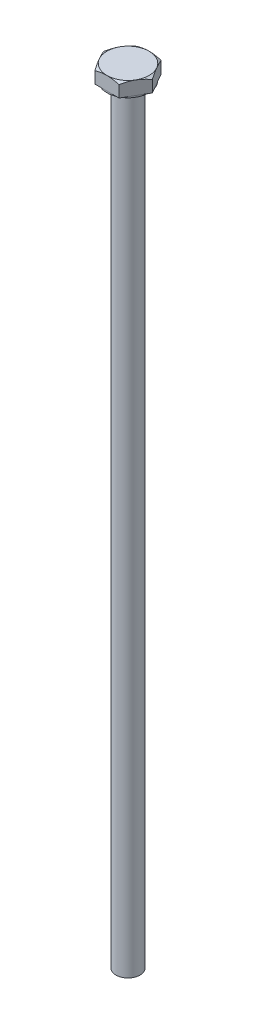
ISO-10303-21;
HEADER;
FILE_DESCRIPTION(('STEP AP214'),'2;1');
FILE_NAME('part.step','',(''),(''),'','','');
FILE_SCHEMA(('AUTOMOTIVE_DESIGN { 1 0 10303 214 1 1 1 1 }'));
ENDSEC;
DATA;
#1=APPLICATION_CONTEXT('core data for automotive mechanical design processes');
#2=APPLICATION_PROTOCOL_DEFINITION('international standard','automotive_design',2000,#1);
#3=PRODUCT_CONTEXT('',#1,'mechanical');
#4=PRODUCT('Part','Part','',(#3));
#5=PRODUCT_RELATED_PRODUCT_CATEGORY('part','',(#4));
#6=PRODUCT_DEFINITION_FORMATION('','',#4);
#7=PRODUCT_DEFINITION_CONTEXT('part definition',#1,'design');
#8=PRODUCT_DEFINITION('design','',#6,#7);
#9=PRODUCT_DEFINITION_SHAPE('','',#8);
#10=(LENGTH_UNIT() NAMED_UNIT(*) SI_UNIT(.MILLI.,.METRE.));
#11=(NAMED_UNIT(*) PLANE_ANGLE_UNIT() SI_UNIT($,.RADIAN.));
#12=(NAMED_UNIT(*) SI_UNIT($,.STERADIAN.) SOLID_ANGLE_UNIT());
#13=UNCERTAINTY_MEASURE_WITH_UNIT(LENGTH_MEASURE(1.E-05),#10,'distance_accuracy_value','');
#14=(GEOMETRIC_REPRESENTATION_CONTEXT(3) GLOBAL_UNCERTAINTY_ASSIGNED_CONTEXT((#13)) GLOBAL_UNIT_ASSIGNED_CONTEXT((#10,
#11,#12)) REPRESENTATION_CONTEXT('',''));
#15=CARTESIAN_POINT('',(0.,0.,0.));
#16=DIRECTION('',(0.,0.,1.));
#17=DIRECTION('',(1.,0.,0.));
#18=AXIS2_PLACEMENT_3D('',#15,#16,#17);
#19=CARTESIAN_POINT('',(6.41580486636972,0.,0.));
#20=DIRECTION('',(0.,1.,0.));
#21=DIRECTION('',(0.,0.,1.));
#22=AXIS2_PLACEMENT_3D('',#19,#20,#21);
#23=PLANE('',#22);
#24=CARTESIAN_POINT('',(0.,0.,0.));
#25=DIRECTION('',(0.,1.,0.));
#26=DIRECTION('',(0.,0.,1.));
#27=AXIS2_PLACEMENT_3D('',#24,#25,#26);
#28=CIRCLE('',#27,3.175);
#29=CARTESIAN_POINT('',(0.,0.,3.175));
#30=VERTEX_POINT('',#29);
#31=EDGE_CURVE('E186',#30,#30,#28,.F.);
#32=ORIENTED_EDGE('',*,*,#31,.F.);
#33=EDGE_LOOP('',(#32));
#34=FACE_BOUND('',#33,.T.);
#35=CARTESIAN_POINT('',(0.,0.,0.));
#36=DIRECTION('',(0.,1.,0.));
#37=DIRECTION('',(0.,0.,1.));
#38=AXIS2_PLACEMENT_3D('',#35,#36,#37);
#39=CIRCLE('',#38,5.55625);
#40=CARTESIAN_POINT('',(0.,0.,5.55625));
#41=VERTEX_POINT('',#40);
#42=EDGE_CURVE('E189',#41,#41,#39,.T.);
#43=ORIENTED_EDGE('',*,*,#42,.F.);
#44=EDGE_LOOP('',(#43));
#45=FACE_BOUND('',#44,.T.);
#46=ADVANCED_FACE('F35',(#34,#45),#23,.F.);
#47=CARTESIAN_POINT('',(0.,-203.2,0.));
#48=DIRECTION('',(0.,1.,0.));
#49=DIRECTION('',(0.,0.,1.));
#50=AXIS2_PLACEMENT_3D('',#47,#48,#49);
#51=CYLINDRICAL_SURFACE('',#50,3.175);
#52=CARTESIAN_POINT('',(0.,-202.833382579065,0.));
#53=DIRECTION('',(0.,-1.,0.));
#54=DIRECTION('',(0.,0.,-1.));
#55=AXIS2_PLACEMENT_3D('',#52,#53,#54);
#56=CIRCLE('',#55,3.175);
#57=CARTESIAN_POINT('',(0.,-202.833382579065,-3.175));
#58=VERTEX_POINT('',#57);
#59=EDGE_CURVE('E11',#58,#58,#56,.F.);
#60=ORIENTED_EDGE('',*,*,#59,.T.);
#61=EDGE_LOOP('',(#60));
#62=FACE_BOUND('',#61,.T.);
#63=ORIENTED_EDGE('',*,*,#31,.T.);
#64=EDGE_LOOP('',(#63));
#65=FACE_BOUND('',#64,.T.);
#66=ADVANCED_FACE('F291',(#62,#65),#51,.T.);
#67=CARTESIAN_POINT('',(0.,-203.2,0.));
#68=DIRECTION('',(0.,-1.,0.));
#69=DIRECTION('',(0.,0.,-1.));
#70=AXIS2_PLACEMENT_3D('',#67,#68,#69);
#71=PLANE('',#70);
#72=CARTESIAN_POINT('',(0.,-203.2,0.));
#73=DIRECTION('',(0.,-1.,0.));
#74=DIRECTION('',(0.,0.,-1.));
#75=AXIS2_PLACEMENT_3D('',#72,#73,#74);
#76=CIRCLE('',#75,2.54);
#77=CARTESIAN_POINT('',(0.,-203.2,-2.54));
#78=VERTEX_POINT('',#77);
#79=EDGE_CURVE('E43',#78,#78,#76,.T.);
#80=ORIENTED_EDGE('',*,*,#79,.T.);
#81=EDGE_LOOP('',(#80));
#82=FACE_BOUND('',#81,.T.);
#83=ADVANCED_FACE('F249',(#82),#71,.T.);
#84=CARTESIAN_POINT('',(0.,0.,0.));
#85=DIRECTION('',(0.,-1.,0.));
#86=DIRECTION('',(0.,0.,-1.));
#87=AXIS2_PLACEMENT_3D('',#84,#85,#86);
#88=CYLINDRICAL_SURFACE('',#87,5.55625);
#89=ORIENTED_EDGE('',*,*,#42,.T.);
#90=EDGE_LOOP('',(#89));
#91=FACE_BOUND('',#90,.T.);
#92=CARTESIAN_POINT('',(0.,0.406400000000005,0.));
#93=DIRECTION('',(0.,-1.,0.));
#94=DIRECTION('',(0.,0.,-1.));
#95=AXIS2_PLACEMENT_3D('',#92,#93,#94);
#96=CIRCLE('',#95,5.55625);
#97=CARTESIAN_POINT('',(4.81185364977728,0.406400000000005,-2.778125));
#98=VERTEX_POINT('',#97);
#99=CARTESIAN_POINT('',(4.81185364977728,0.406400000000005,2.778125));
#100=VERTEX_POINT('',#99);
#101=EDGE_CURVE('E155',#98,#100,#96,.T.);
#102=ORIENTED_EDGE('',*,*,#101,.T.);
#103=CARTESIAN_POINT('',(0.,0.406400000000005,5.55625));
#104=VERTEX_POINT('',#103);
#105=EDGE_CURVE('E323',#100,#104,#96,.T.);
#106=ORIENTED_EDGE('',*,*,#105,.T.);
#107=CARTESIAN_POINT('',(-4.81185364977728,0.406400000000005,2.778125));
#108=VERTEX_POINT('',#107);
#109=EDGE_CURVE('E214',#104,#108,#96,.T.);
#110=ORIENTED_EDGE('',*,*,#109,.T.);
#111=CARTESIAN_POINT('',(-4.81185364977728,0.406400000000005,-2.778125));
#112=VERTEX_POINT('',#111);
#113=EDGE_CURVE('E147',#108,#112,#96,.T.);
#114=ORIENTED_EDGE('',*,*,#113,.T.);
#115=CARTESIAN_POINT('',(0.,0.406400000000005,-5.55625));
#116=VERTEX_POINT('',#115);
#117=EDGE_CURVE('E128',#112,#116,#96,.T.);
#118=ORIENTED_EDGE('',*,*,#117,.T.);
#119=EDGE_CURVE('E143',#116,#98,#96,.T.);
#120=ORIENTED_EDGE('',*,*,#119,.T.);
#121=EDGE_LOOP('',(#102,#106,#110,#114,#118,#120));
#122=FACE_BOUND('',#121,.T.);
#123=ADVANCED_FACE('F142',(#91,#122),#88,.T.);
#124=CARTESIAN_POINT('',(0.,0.406400000000007,-11.7264211943431));
#125=DIRECTION('',(0.,1.,0.));
#126=DIRECTION('',(0.,0.,1.));
#127=AXIS2_PLACEMENT_3D('',#124,#125,#126);
#128=PLANE('',#127);
#129=DIRECTION('',(1.,0.,0.));
#130=VECTOR('',#129,1.);
#131=CARTESIAN_POINT('',(-3.20790243318486,0.406400000000006,5.55625));
#132=LINE('',#131,#130);
#133=CARTESIAN_POINT('',(3.20790243318485,0.406400000000006,5.55625));
#134=VERTEX_POINT('',#133);
#135=EDGE_CURVE('E197',#104,#134,#132,.T.);
#136=ORIENTED_EDGE('',*,*,#135,.F.);
#137=ORIENTED_EDGE('',*,*,#105,.F.);
#138=DIRECTION('',(0.500000000000001,0.,-0.866025403784438));
#139=VECTOR('',#138,1.);
#140=CARTESIAN_POINT('',(3.20790243318485,0.406400000000006,5.55625));
#141=LINE('',#140,#139);
#142=EDGE_CURVE('E170',#134,#100,#141,.T.);
#143=ORIENTED_EDGE('',*,*,#142,.F.);
#144=EDGE_LOOP('',(#136,#137,#143));
#145=FACE_BOUND('',#144,.T.);
#146=ADVANCED_FACE('F247',(#145),#128,.F.);
#147=ORIENTED_EDGE('',*,*,#109,.F.);
#148=CARTESIAN_POINT('',(-3.20790243318486,0.406400000000006,5.55625));
#149=VERTEX_POINT('',#148);
#150=EDGE_CURVE('E199',#149,#104,#132,.T.);
#151=ORIENTED_EDGE('',*,*,#150,.F.);
#152=DIRECTION('',(0.5,0.,0.866025403784439));
#153=VECTOR('',#152,1.);
#154=CARTESIAN_POINT('',(-6.41580486636971,0.406400000000006,0.));
#155=LINE('',#154,#153);
#156=EDGE_CURVE('E213',#108,#149,#155,.T.);
#157=ORIENTED_EDGE('',*,*,#156,.F.);
#158=EDGE_LOOP('',(#147,#151,#157));
#159=FACE_BOUND('',#158,.T.);
#160=ADVANCED_FACE('F212',(#159),#128,.F.);
#161=ORIENTED_EDGE('',*,*,#113,.F.);
#162=CARTESIAN_POINT('',(-6.41580486636971,0.406400000000006,0.));
#163=VERTEX_POINT('',#162);
#164=EDGE_CURVE('E220',#163,#108,#155,.T.);
#165=ORIENTED_EDGE('',*,*,#164,.F.);
#166=DIRECTION('',(-0.5,0.,0.866025403784439));
#167=VECTOR('',#166,1.);
#168=CARTESIAN_POINT('',(-3.20790243318486,0.406400000000006,-5.55625));
#169=LINE('',#168,#167);
#170=EDGE_CURVE('E164',#112,#163,#169,.T.);
#171=ORIENTED_EDGE('',*,*,#170,.F.);
#172=EDGE_LOOP('',(#161,#165,#171));
#173=FACE_BOUND('',#172,.T.);
#174=ADVANCED_FACE('F315',(#173),#128,.F.);
#175=ORIENTED_EDGE('',*,*,#117,.F.);
#176=CARTESIAN_POINT('',(-3.20790243318486,0.406400000000006,-5.55625));
#177=VERTEX_POINT('',#176);
#178=EDGE_CURVE('E131',#177,#112,#169,.T.);
#179=ORIENTED_EDGE('',*,*,#178,.F.);
#180=DIRECTION('',(-1.,0.,0.));
#181=VECTOR('',#180,1.);
#182=CARTESIAN_POINT('',(3.20790243318486,0.406400000000006,-5.55625));
#183=LINE('',#182,#181);
#184=EDGE_CURVE('E125',#116,#177,#183,.T.);
#185=ORIENTED_EDGE('',*,*,#184,.F.);
#186=EDGE_LOOP('',(#175,#179,#185));
#187=FACE_BOUND('',#186,.T.);
#188=ADVANCED_FACE('F127',(#187),#128,.F.);
#189=ORIENTED_EDGE('',*,*,#119,.F.);
#190=CARTESIAN_POINT('',(3.20790243318486,0.406400000000006,-5.55625));
#191=VERTEX_POINT('',#190);
#192=EDGE_CURVE('E136',#191,#116,#183,.T.);
#193=ORIENTED_EDGE('',*,*,#192,.F.);
#194=DIRECTION('',(-0.5,0.,-0.866025403784439));
#195=VECTOR('',#194,1.);
#196=CARTESIAN_POINT('',(6.41580486636972,0.406400000000006,0.));
#197=LINE('',#196,#195);
#198=EDGE_CURVE('E152',#98,#191,#197,.T.);
#199=ORIENTED_EDGE('',*,*,#198,.F.);
#200=EDGE_LOOP('',(#189,#193,#199));
#201=FACE_BOUND('',#200,.T.);
#202=ADVANCED_FACE('F150',(#201),#128,.F.);
#203=ORIENTED_EDGE('',*,*,#101,.F.);
#204=CARTESIAN_POINT('',(6.41580486636972,0.406400000000006,0.));
#205=VERTEX_POINT('',#204);
#206=EDGE_CURVE('E161',#205,#98,#197,.T.);
#207=ORIENTED_EDGE('',*,*,#206,.F.);
#208=EDGE_CURVE('E167',#100,#205,#141,.T.);
#209=ORIENTED_EDGE('',*,*,#208,.F.);
#210=EDGE_LOOP('',(#203,#207,#209));
#211=FACE_BOUND('',#210,.T.);
#212=ADVANCED_FACE('F288',(#211),#128,.F.);
#213=CARTESIAN_POINT('',(-3.20790243318486,3.96875,5.55625));
#214=DIRECTION('',(0.,0.,-1.));
#215=DIRECTION('',(-1.,0.,0.));
#216=AXIS2_PLACEMENT_3D('',#213,#214,#215);
#217=PLANE('',#216);
#218=DIRECTION('',(0.,-1.,0.));
#219=VECTOR('',#218,1.);
#220=CARTESIAN_POINT('',(3.20790243318485,3.96875,5.55625));
#221=LINE('',#220,#219);
#222=CARTESIAN_POINT('',(3.20790243318485,3.4724857665182,5.55625));
#223=VERTEX_POINT('',#222);
#224=EDGE_CURVE('E171',#223,#134,#221,.T.);
#225=ORIENTED_EDGE('',*,*,#224,.F.);
#226=CARTESIAN_POINT('',(-8.68734534554284,1.22288938742342,5.55624999999999));
#227=CARTESIAN_POINT('',(-8.44403401353456,1.34119905809298,5.55624999999999));
#228=CARTESIAN_POINT('',(-8.20017159293554,1.45839442815547,5.55624999999999));
#229=CARTESIAN_POINT('',(-7.71105171677545,1.68993113800692,5.55624999999999));
#230=CARTESIAN_POINT('',(-7.46579405477797,1.80427204122029,5.55624999999999));
#231=CARTESIAN_POINT('',(-6.97236111566638,2.03003444182377,5.55624999999999));
#232=CARTESIAN_POINT('',(-6.72417726525658,2.14143726460184,5.55625));
#233=CARTESIAN_POINT('',(-6.22585973018659,2.35977620902458,5.55625));
#234=CARTESIAN_POINT('',(-5.97572613633338,2.4667125372333,5.55625));
#235=CARTESIAN_POINT('',(-5.46483883731768,2.67836867451779,5.55625));
#236=CARTESIAN_POINT('',(-5.20400651938956,2.78289974494566,5.55625));
#237=CARTESIAN_POINT('',(-4.67931642792442,2.98421992413496,5.55625));
#238=CARTESIAN_POINT('',(-4.41545832255399,3.08100817428767,5.55625));
#239=CARTESIAN_POINT('',(-3.88476900468176,3.26435418112535,5.55625));
#240=CARTESIAN_POINT('',(-3.61794480314064,3.35093203439816,5.55625));
#241=CARTESIAN_POINT('',(-3.08046684246026,3.51112516566962,5.55625));
#242=CARTESIAN_POINT('',(-2.80981429525509,3.58474445093335,5.55625));
#243=CARTESIAN_POINT('',(-2.26602052259096,3.71515100516671,5.55625));
#244=CARTESIAN_POINT('',(-1.99290165325107,3.77203002698699,5.55625));
#245=CARTESIAN_POINT('',(-1.44315650529014,3.8657666223498,5.55625));
#246=CARTESIAN_POINT('',(-1.16653059437651,3.90262627741113,5.55625));
#247=CARTESIAN_POINT('',(-0.751900361647941,3.94045737507377,5.55625));
#248=CARTESIAN_POINT('',(-0.614658359255131,3.95015005719274,5.55625));
#249=CARTESIAN_POINT('',(-0.339891782868685,3.96372361746654,5.55625));
#250=CARTESIAN_POINT('',(-0.20236723656794,3.96760504030944,5.55625));
#251=CARTESIAN_POINT('',(0.0727333713623869,3.96945842401414,5.55625));
#252=CARTESIAN_POINT('',(0.21030943647873,3.96742986081756,5.55625));
#253=CARTESIAN_POINT('',(0.485240684726246,3.95751476306193,5.55625));
#254=CARTESIAN_POINT('',(0.622595875844289,3.94962844532224,5.55625));
#255=CARTESIAN_POINT('',(0.950534034943967,3.92397508879709,5.55625));
#256=CARTESIAN_POINT('',(1.14091355574137,3.9035492263498,5.55625));
#257=CARTESIAN_POINT('',(1.52029719063807,3.8525416099763,5.55625));
#258=CARTESIAN_POINT('',(1.70930112302448,3.82195853831937,5.55625));
#259=CARTESIAN_POINT('',(2.27400693845997,3.71659209222399,5.55625));
#260=CARTESIAN_POINT('',(2.6472069344406,3.62820887450021,5.55625));
#261=CARTESIAN_POINT('',(3.20545822647875,3.47443404020821,5.55625));
#262=CARTESIAN_POINT('',(3.39338950773942,3.41889245335957,5.55625));
#263=CARTESIAN_POINT('',(3.76742734873255,3.30191709580318,5.55625));
#264=CARTESIAN_POINT('',(3.95353389495647,3.24048328151142,5.55625));
#265=CARTESIAN_POINT('',(4.32398030388946,3.11271955288081,5.55625));
#266=CARTESIAN_POINT('',(4.50832068183301,3.04639111880056,5.55625));
#267=CARTESIAN_POINT('',(4.8754639707428,2.90963103920262,5.55625));
#268=CARTESIAN_POINT('',(5.05826691236168,2.83919947571403,5.55625));
#269=CARTESIAN_POINT('',(5.53648838906583,2.64976613223356,5.55625));
#270=CARTESIAN_POINT('',(5.83079159509504,2.52795186524654,5.55625));
#271=CARTESIAN_POINT('',(6.41649643187878,2.27751345010424,5.55625));
#272=CARTESIAN_POINT('',(6.70789777783551,2.14888864121572,5.55625));
#273=CARTESIAN_POINT('',(7.28843809826103,1.8863887293494,5.55625));
#274=CARTESIAN_POINT('',(7.57757626787838,1.75251185203033,5.55625));
#275=CARTESIAN_POINT('',(8.15393065619655,1.48072157646874,5.55625));
#276=CARTESIAN_POINT('',(8.4411469422188,1.34280832053513,5.55625));
#277=CARTESIAN_POINT('',(9.01444809884656,1.06359381695452,5.55625));
#278=CARTESIAN_POINT('',(9.30053068147656,0.922287880715783,5.55625));
#279=CARTESIAN_POINT('',(9.87141972176678,0.637120804071724,5.55625));
#280=CARTESIAN_POINT('',(10.1562261702553,0.493259645338591,5.55625));
#281=CARTESIAN_POINT('',(11.0089651001863,0.0586597796246895,5.55625));
#282=CARTESIAN_POINT('',(11.5753311111569,-0.23515133476805,5.55625000000001));
#283=CARTESIAN_POINT('',(12.6482487361919,-0.798430271693502,5.55625000000001));
#284=CARTESIAN_POINT('',(13.1550792731973,-1.06736933165848,5.55625000000001));
#285=CARTESIAN_POINT('',(14.1670057181828,-1.60855542363547,5.55625000000001));
#286=CARTESIAN_POINT('',(14.6721015300007,-1.88080263535204,5.55625000000001));
#287=CARTESIAN_POINT('',(15.6793796565129,-2.4269041414928,5.55625000000001));
#288=CARTESIAN_POINT('',(16.1815661431465,-2.70075075290614,5.55625000000001));
#289=CARTESIAN_POINT('',(17.1848531851837,-3.25034123577064,5.55625000000001));
#290=CARTESIAN_POINT('',(17.685953816338,-3.52608496888027,5.55625000000001));
#291=CARTESIAN_POINT('',(18.1866690042647,-3.80252245283117,5.55625000000001));
#292=B_SPLINE_CURVE_WITH_KNOTS('',3,(#226,#227,#228,#229,#230,#231,#232,#233,#234,#235,#236,
#237,#238,#239,#240,#241,#242,#243,#244,#245,#246,#247,#248,#249,#250,#251,#252,#253,#254,#255,
#256,#257,#258,#259,#260,#261,#262,#263,#264,#265,#266,#267,#268,#269,#270,#271,#272,#273,#274,
#275,#276,#277,#278,#279,#280,#281,#282,#283,#284,#285,#286,#287,#288,#289,#290,#291),
.UNSPECIFIED.,.F.,.F.,(4,2,2,2,2,2,2,2,2,2,2,2,2,2,2,2,2,2,2,2,2,2,2,2,2,2,2,2,2,2,2,2,4),(0.,
0.811661141880225,1.62344567179246,2.43953067997721,3.25557790441238,4.0984789219871,
4.94147328046563,5.78277970151366,6.6238255009087,7.46017183264461,8.29643118840029,
8.70907840772684,9.12168694729814,9.53433207537242,9.94696193053012,10.5210556836029,
11.095223945004,12.2441478344629,12.8319975977916,13.4198517097007,14.007528762346,
14.5951940702738,15.5506195612893,16.5061379145493,17.4619819047883,18.4177922357382,
19.3750096144276,20.3322338617106,22.2463014866758,23.9675816567595,25.6889557515376,
27.4049494008714,29.1208192158532),.UNSPECIFIED.);
#293=CARTESIAN_POINT('',(0.,3.96875,5.55625));
#294=VERTEX_POINT('',#293);
#295=EDGE_CURVE('E328',#223,#294,#292,.F.);
#296=ORIENTED_EDGE('',*,*,#295,.T.);
#297=CARTESIAN_POINT('',(-3.20790243318486,3.4724857665182,5.55625));
#298=VERTEX_POINT('',#297);
#299=EDGE_CURVE('E254',#294,#298,#292,.F.);
#300=ORIENTED_EDGE('',*,*,#299,.T.);
#301=DIRECTION('',(0.,-1.,0.));
#302=VECTOR('',#301,1.);
#303=CARTESIAN_POINT('',(-3.20790243318486,3.96875,5.55625));
#304=LINE('',#303,#302);
#305=EDGE_CURVE('E174',#298,#149,#304,.T.);
#306=ORIENTED_EDGE('',*,*,#305,.T.);
#307=ORIENTED_EDGE('',*,*,#150,.T.);
#308=ORIENTED_EDGE('',*,*,#135,.T.);
#309=EDGE_LOOP('',(#225,#296,#300,#306,#307,#308));
#310=FACE_BOUND('',#309,.T.);
#311=ADVANCED_FACE('F206',(#310),#217,.F.);
#312=CARTESIAN_POINT('',(-6.41580486636971,3.96875,0.));
#313=DIRECTION('',(0.866025403784439,0.,-0.5));
#314=DIRECTION('',(-0.5,0.,-0.866025403784439));
#315=AXIS2_PLACEMENT_3D('',#312,#313,#314);
#316=PLANE('',#315);
#317=ORIENTED_EDGE('',*,*,#305,.F.);
#318=CARTESIAN_POINT('',(-3.20778696313102,3.47241909805179,5.55645));
#319=CARTESIAN_POINT('',(-3.27830048099899,3.51312443962873,5.43431700443227));
#320=CARTESIAN_POINT('',(-3.34907690760433,3.55198246063681,5.31172863757364));
#321=CARTESIAN_POINT('',(-3.49120454378004,3.62549506657542,5.06555635055764));
#322=CARTESIAN_POINT('',(-3.56255598725623,3.66014783819809,4.94197202526351));
#323=CARTESIAN_POINT('',(-3.7777527611819,3.75711811443887,4.56924027919934));
#324=CARTESIAN_POINT('',(-3.92244755263586,3.81227394549796,4.3186215488105));
#325=CARTESIAN_POINT('',(-4.13898067940738,3.87695109515299,3.94357517172046));
#326=CARTESIAN_POINT('',(-4.21017202280889,3.89537582963736,3.82026814788997));
#327=CARTESIAN_POINT('',(-4.35287639627881,3.92627163375964,3.57309692257778));
#328=CARTESIAN_POINT('',(-4.42438939736051,3.93874322943797,3.44923277130254));
#329=CARTESIAN_POINT('',(-4.56753961185542,3.95741491340171,3.20128932668298));
#330=CARTESIAN_POINT('',(-4.63917659144933,3.96362211931661,3.07721043832556));
#331=CARTESIAN_POINT('',(-4.7825127822332,3.96963858258616,2.82894487332451));
#332=CARTESIAN_POINT('',(-4.85421199143242,3.96944803757272,2.70475820012895));
#333=CARTESIAN_POINT('',(-5.05064720059277,3.9601317573071,2.36452243746779));
#334=CARTESIAN_POINT('',(-5.1753189069971,3.94449034031059,2.14858470770919));
#335=CARTESIAN_POINT('',(-5.42383425573453,3.89489009502544,1.71814349723526));
#336=CARTESIAN_POINT('',(-5.54767702400135,3.86091431173333,1.50364153044716));
#337=CARTESIAN_POINT('',(-5.7966925582286,3.77598424995191,1.07233397329164));
#338=CARTESIAN_POINT('',(-5.92183390122649,3.72467011195788,0.855582809091896));
#339=CARTESIAN_POINT('',(-6.17025031750736,3.6082075447076,0.425312954659245));
#340=CARTESIAN_POINT('',(-6.29352857247572,3.54308647412057,0.211788753585619));
#341=CARTESIAN_POINT('',(-6.41592033642355,3.47241909805179,-0.000200000000002303));
#342=B_SPLINE_CURVE_WITH_KNOTS('',3,(#318,#319,#320,#321,#322,#323,#324,#325,#326,#327,#328,
#329,#330,#331,#332,#333,#334,#335,#336,#337,#338,#339,#340,#341),.UNSPECIFIED.,.F.,.F.,(4,2,2,
2,2,2,2,2,2,2,2,4),(0.,0.44031690826804,0.880823012040822,1.76366572331169,2.19427472390782,
2.62484566732156,3.05492684132791,3.48499472977669,4.23370964386674,4.98311813377593,
5.74914806559356,6.51367405016872),.UNSPECIFIED.);
#343=CARTESIAN_POINT('',(-4.81185364977728,3.96875,2.778125));
#344=VERTEX_POINT('',#343);
#345=EDGE_CURVE('E263',#298,#344,#342,.T.);
#346=ORIENTED_EDGE('',*,*,#345,.T.);
#347=CARTESIAN_POINT('',(-6.41580486636971,3.4724857665182,0.));
#348=VERTEX_POINT('',#347);
#349=EDGE_CURVE('E50',#344,#348,#342,.T.);
#350=ORIENTED_EDGE('',*,*,#349,.T.);
#351=DIRECTION('',(0.,-1.,0.));
#352=VECTOR('',#351,1.);
#353=CARTESIAN_POINT('',(-6.41580486636971,3.96875,0.));
#354=LINE('',#353,#352);
#355=EDGE_CURVE('E177',#348,#163,#354,.T.);
#356=ORIENTED_EDGE('',*,*,#355,.T.);
#357=ORIENTED_EDGE('',*,*,#164,.T.);
#358=ORIENTED_EDGE('',*,*,#156,.T.);
#359=EDGE_LOOP('',(#317,#346,#350,#356,#357,#358));
#360=FACE_BOUND('',#359,.T.);
#361=ADVANCED_FACE('F218',(#360),#316,.F.);
#362=CARTESIAN_POINT('',(-3.20790243318486,3.96875,-5.55625));
#363=DIRECTION('',(0.866025403784438,0.,0.5));
#364=DIRECTION('',(0.5,0.,-0.866025403784439));
#365=AXIS2_PLACEMENT_3D('',#362,#363,#364);
#366=PLANE('',#365);
#367=ORIENTED_EDGE('',*,*,#355,.F.);
#368=CARTESIAN_POINT('',(-6.41592033642355,3.47241909805179,0.000199999999997433));
#369=CARTESIAN_POINT('',(-6.34540681855559,3.51312443962873,-0.121932995567733));
#370=CARTESIAN_POINT('',(-6.27463039195025,3.55198246063681,-0.244521362426355));
#371=CARTESIAN_POINT('',(-6.13250275577453,3.62549506657542,-0.490693649442358));
#372=CARTESIAN_POINT('',(-6.06115131229835,3.66014783819809,-0.614277974736488));
#373=CARTESIAN_POINT('',(-5.84595453837268,3.75711811443887,-0.987009720800663));
#374=CARTESIAN_POINT('',(-5.70125974691872,3.81227394549796,-1.2376284511895));
#375=CARTESIAN_POINT('',(-5.48472662014719,3.87695109515299,-1.61267482827954));
#376=CARTESIAN_POINT('',(-5.41353527674569,3.89537582963736,-1.73598185211002));
#377=CARTESIAN_POINT('',(-5.27083090327576,3.92627163375964,-1.98315307742221));
#378=CARTESIAN_POINT('',(-5.19931790219406,3.93874322943797,-2.10701722869746));
#379=CARTESIAN_POINT('',(-5.05616768769915,3.95741491340171,-2.35496067331701));
#380=CARTESIAN_POINT('',(-4.98453070810525,3.96362211931661,-2.47903956167444));
#381=CARTESIAN_POINT('',(-4.84119451732137,3.96963858258616,-2.72730512667549));
#382=CARTESIAN_POINT('',(-4.76949530812215,3.96944803757272,-2.85149179987105));
#383=CARTESIAN_POINT('',(-4.5730600989618,3.9601317573071,-3.1917275625322));
#384=CARTESIAN_POINT('',(-4.44838839255747,3.94449034031059,-3.40766529229081));
#385=CARTESIAN_POINT('',(-4.19987304382004,3.89489009502544,-3.83810650276474));
#386=CARTESIAN_POINT('',(-4.07603027555322,3.86091431173333,-4.05260846955284));
#387=CARTESIAN_POINT('',(-3.82701474132597,3.77598424995191,-4.48391602670836));
#388=CARTESIAN_POINT('',(-3.70187339832808,3.72467011195788,-4.7006671909081));
#389=CARTESIAN_POINT('',(-3.45345698204721,3.6082075447076,-5.13093704534075));
#390=CARTESIAN_POINT('',(-3.33017872707885,3.54308647412057,-5.34446124641438));
#391=CARTESIAN_POINT('',(-3.20778696313102,3.47241909805179,-5.55645));
#392=B_SPLINE_CURVE_WITH_KNOTS('',3,(#368,#369,#370,#371,#372,#373,#374,#375,#376,#377,#378,
#379,#380,#381,#382,#383,#384,#385,#386,#387,#388,#389,#390,#391),.UNSPECIFIED.,.F.,.F.,(4,2,2,
2,2,2,2,2,2,2,2,4),(0.,0.44031690826804,0.880823012040821,1.76366572331169,2.19427472390782,
2.62484566732156,3.05492684132791,3.48499472977669,4.23370964386674,4.98311813377593,
5.74914806559356,6.51367405016872),.UNSPECIFIED.);
#393=CARTESIAN_POINT('',(-4.81185364977728,3.96875,-2.778125));
#394=VERTEX_POINT('',#393);
#395=EDGE_CURVE('E274',#348,#394,#392,.T.);
#396=ORIENTED_EDGE('',*,*,#395,.T.);
#397=CARTESIAN_POINT('',(-3.20790243318486,3.4724857665182,-5.55625));
#398=VERTEX_POINT('',#397);
#399=EDGE_CURVE('E58',#394,#398,#392,.T.);
#400=ORIENTED_EDGE('',*,*,#399,.T.);
#401=DIRECTION('',(0.,-1.,0.));
#402=VECTOR('',#401,1.);
#403=CARTESIAN_POINT('',(-3.20790243318486,3.96875,-5.55625));
#404=LINE('',#403,#402);
#405=EDGE_CURVE('E180',#398,#177,#404,.T.);
#406=ORIENTED_EDGE('',*,*,#405,.T.);
#407=ORIENTED_EDGE('',*,*,#178,.T.);
#408=ORIENTED_EDGE('',*,*,#170,.T.);
#409=EDGE_LOOP('',(#367,#396,#400,#406,#407,#408));
#410=FACE_BOUND('',#409,.T.);
#411=ADVANCED_FACE('F279',(#410),#366,.F.);
#412=CARTESIAN_POINT('',(3.20790243318486,3.96875,-5.55625));
#413=DIRECTION('',(0.,0.,1.));
#414=DIRECTION('',(1.,0.,0.));
#415=AXIS2_PLACEMENT_3D('',#412,#413,#414);
#416=PLANE('',#415);
#417=ORIENTED_EDGE('',*,*,#405,.F.);
#418=CARTESIAN_POINT('',(-8.68734534705808,1.22288938668644,-5.55625));
#419=CARTESIAN_POINT('',(-8.44403401499881,1.34119905738678,-5.55625));
#420=CARTESIAN_POINT('',(-8.20017159434878,1.45839442748002,-5.55625));
#421=CARTESIAN_POINT('',(-7.7110517180865,1.68993113739285,-5.55625));
#422=CARTESIAN_POINT('',(-7.46579405603784,1.80427204063683,-5.55625));
#423=CARTESIAN_POINT('',(-6.97236111682313,2.03003444130155,-5.55625));
#424=CARTESIAN_POINT('',(-6.72417726636136,2.14143726411026,-5.55625));
#425=CARTESIAN_POINT('',(-6.22585973118709,2.35977620859374,-5.55625));
#426=CARTESIAN_POINT('',(-5.97572613728156,2.46671253683258,-5.55625));
#427=CARTESIAN_POINT('',(-5.46483883815724,2.67836867417814,-5.55625));
#428=CARTESIAN_POINT('',(-5.20400652017278,2.78289974463688,-5.55625));
#429=CARTESIAN_POINT('',(-4.67931642859405,2.98421992388629,-5.55625));
#430=CARTESIAN_POINT('',(-4.41545832316638,3.08100817406822,-5.55625));
#431=CARTESIAN_POINT('',(-3.88476900517859,3.26435418096156,-5.55625));
#432=CARTESIAN_POINT('',(-3.61794480357916,3.3509320342608,-5.55625));
#433=CARTESIAN_POINT('',(-3.08046684278059,3.5111251655808,-5.55625));
#434=CARTESIAN_POINT('',(-2.80981429551552,3.58474445086664,-5.55625));
#435=CARTESIAN_POINT('',(-2.26602052270076,3.71515100514461,-5.55625));
#436=CARTESIAN_POINT('',(-1.99290165326973,3.77203002698566,-5.55625));
#437=CARTESIAN_POINT('',(-1.44315650512428,3.86576662237623,-5.55625));
#438=CARTESIAN_POINT('',(-1.16653059411728,3.90262627744456,-5.55625));
#439=CARTESIAN_POINT('',(-0.751900361249319,3.9404573751053,-5.55625));
#440=CARTESIAN_POINT('',(-0.614658358810713,3.95015005722162,-5.55625));
#441=CARTESIAN_POINT('',(-0.339891782332772,3.9637236174861,-5.55625));
#442=CARTESIAN_POINT('',(-0.202367235986329,3.96760504032231,-5.55625));
#443=CARTESIAN_POINT('',(0.0727333720350613,3.96945842400971,-5.55625));
#444=CARTESIAN_POINT('',(0.210309437196768,3.96742986080251,-5.55625));
#445=CARTESIAN_POINT('',(0.485240685534411,3.95751476302195,-5.55625));
#446=CARTESIAN_POINT('',(0.622595876697215,3.94962844526796,-5.55625));
#447=CARTESIAN_POINT('',(0.950534035866153,3.92397508870766,-5.55625));
#448=CARTESIAN_POINT('',(1.14091355668786,3.90354922624012,-5.55625));
#449=CARTESIAN_POINT('',(1.52029719163205,3.85254160982505,-5.55625));
#450=CARTESIAN_POINT('',(1.70930112404167,3.8219585381468,-5.55625));
#451=CARTESIAN_POINT('',(2.27400693954551,3.71659209198699,-5.55625));
#452=CARTESIAN_POINT('',(2.64720693556994,3.62820887421967,-5.55625));
#453=CARTESIAN_POINT('',(3.2054582276736,3.47443403986343,-5.55625));
#454=CARTESIAN_POINT('',(3.39338950895656,3.41889245299323,-5.55625));
#455=CARTESIAN_POINT('',(3.76742734999405,3.30191709539437,-5.55625));
#456=CARTESIAN_POINT('',(3.95353389624003,3.2404832810817,-5.55625));
#457=CARTESIAN_POINT('',(4.32398030521696,3.11271955241001,-5.55625));
#458=CARTESIAN_POINT('',(4.5083206831824,3.04639111830959,-5.55625));
#459=CARTESIAN_POINT('',(4.87546397213598,2.909631038672,-5.55625));
#460=CARTESIAN_POINT('',(5.05826691377675,2.83919947516395,-5.55625));
#461=CARTESIAN_POINT('',(5.536488390494,2.64976613165079,-5.55625));
#462=CARTESIAN_POINT('',(5.83079159651498,2.52795186465245,-5.55625));
#463=CARTESIAN_POINT('',(6.41649643328333,2.27751344949066,-5.55625));
#464=CARTESIAN_POINT('',(6.70789777923288,2.14888864059396,-5.55624999999999));
#465=CARTESIAN_POINT('',(7.2884380996448,1.88638872871363,-5.55624999999999));
#466=CARTESIAN_POINT('',(7.57757626925573,1.75251185138871,-5.55624999999999));
#467=CARTESIAN_POINT('',(8.15393065756174,1.48072157581708,-5.55624999999999));
#468=CARTESIAN_POINT('',(8.44114694357826,1.34280831987927,-5.55624999999999));
#469=CARTESIAN_POINT('',(9.01444810019475,1.06359381629166,-5.55624999999999));
#470=CARTESIAN_POINT('',(9.30053068281922,0.922287880050117,-5.55624999999999));
#471=CARTESIAN_POINT('',(9.87141972309879,0.637120803401376,-5.55624999999999));
#472=CARTESIAN_POINT('',(10.1562261715822,0.493259644666368,-5.55624999999999));
#473=CARTESIAN_POINT('',(11.0089651014985,0.0586597789478313,-5.55624999999999));
#474=CARTESIAN_POINT('',(11.5753311124599,-0.235151335446625,-5.55624999999999));
#475=CARTESIAN_POINT('',(12.6482487374857,-0.79843027237764,-5.55624999999999));
#476=CARTESIAN_POINT('',(13.155079274491,-1.06736933234669,-5.55624999999999));
#477=CARTESIAN_POINT('',(14.1670057194765,-1.60855542433098,-5.55624999999999));
#478=CARTESIAN_POINT('',(14.6721015312946,-1.88080263605079,-5.55624999999999));
#479=CARTESIAN_POINT('',(15.6793796578088,-2.42690414219812,-5.55624999999999));
#480=CARTESIAN_POINT('',(16.1815661444441,-2.70075075361481,-5.55624999999999));
#481=CARTESIAN_POINT('',(17.184853186485,-3.25034123648561,-5.55624999999999));
#482=CARTESIAN_POINT('',(17.6859538176414,-3.5260849695982,-5.55624999999999));
#483=CARTESIAN_POINT('',(18.1866690055701,-3.80252245355193,-5.55624999999999));
#484=B_SPLINE_CURVE_WITH_KNOTS('',3,(#418,#419,#420,#421,#422,#423,#424,#425,#426,#427,#428,
#429,#430,#431,#432,#433,#434,#435,#436,#437,#438,#439,#440,#441,#442,#443,#444,#445,#446,#447,
#448,#449,#450,#451,#452,#453,#454,#455,#456,#457,#458,#459,#460,#461,#462,#463,#464,#465,#466,
#467,#468,#469,#470,#471,#472,#473,#474,#475,#476,#477,#478,#479,#480,#481,#482,#483),
.UNSPECIFIED.,.F.,.F.,(4,2,2,2,2,2,2,2,2,2,2,2,2,2,2,2,2,2,2,2,2,2,2,2,2,2,2,2,2,2,2,2,4),(0.,
0.811661142058146,1.62344567214833,2.43953068051293,3.25557790512793,4.09847892289398,
4.9414732815639,5.78277970280268,6.62382550238833,7.46017183440405,8.29643119043914,
8.70907840990206,9.12168694960971,9.53433207782041,9.94696193311453,10.5210556862662,
11.0952239477462,12.2441478373633,12.8319976007745,13.4198517127662,14.0075287654937,
14.5951940735038,15.5506195645097,16.5061379177599,17.4619819079888,18.4177922389287,
19.3750096176069,20.3322338648788,22.2463014898221,23.9675816599111,25.6889557546944,
27.4049494040376,29.1208192190289),.UNSPECIFIED.);
#485=CARTESIAN_POINT('',(0.,3.96875,-5.55625));
#486=VERTEX_POINT('',#485);
#487=EDGE_CURVE('E221',#398,#486,#484,.T.);
#488=ORIENTED_EDGE('',*,*,#487,.T.);
#489=CARTESIAN_POINT('',(3.20790243318486,3.4724857665182,-5.55625));
#490=VERTEX_POINT('',#489);
#491=EDGE_CURVE('E223',#486,#490,#484,.T.);
#492=ORIENTED_EDGE('',*,*,#491,.T.);
#493=DIRECTION('',(0.,-1.,0.));
#494=VECTOR('',#493,1.);
#495=CARTESIAN_POINT('',(3.20790243318486,3.96875,-5.55625));
#496=LINE('',#495,#494);
#497=EDGE_CURVE('E160',#490,#191,#496,.T.);
#498=ORIENTED_EDGE('',*,*,#497,.T.);
#499=ORIENTED_EDGE('',*,*,#192,.T.);
#500=ORIENTED_EDGE('',*,*,#184,.T.);
#501=EDGE_LOOP('',(#417,#488,#492,#498,#499,#500));
#502=FACE_BOUND('',#501,.T.);
#503=ADVANCED_FACE('F157',(#502),#416,.F.);
#504=CARTESIAN_POINT('',(6.41580486636972,3.96875,0.));
#505=DIRECTION('',(-0.866025403784439,0.,0.5));
#506=DIRECTION('',(0.5,0.,0.866025403784439));
#507=AXIS2_PLACEMENT_3D('',#504,#505,#506);
#508=PLANE('',#507);
#509=ORIENTED_EDGE('',*,*,#497,.F.);
#510=CARTESIAN_POINT('',(3.20778696313102,3.47241909805179,-5.55645));
#511=CARTESIAN_POINT('',(3.27830048099899,3.51312443962873,-5.43431700443227));
#512=CARTESIAN_POINT('',(3.34907690760433,3.55198246063681,-5.31172863757364));
#513=CARTESIAN_POINT('',(3.49120454378004,3.62549506657542,-5.06555635055764));
#514=CARTESIAN_POINT('',(3.56255598725623,3.66014783819809,-4.94197202526351));
#515=CARTESIAN_POINT('',(3.7777527611819,3.75711811443887,-4.56924027919934));
#516=CARTESIAN_POINT('',(3.92244755263586,3.81227394549796,-4.3186215488105));
#517=CARTESIAN_POINT('',(4.13898067940738,3.87695109515299,-3.94357517172046));
#518=CARTESIAN_POINT('',(4.21017202280889,3.89537582963736,-3.82026814788997));
#519=CARTESIAN_POINT('',(4.35287639627881,3.92627163375964,-3.57309692257778));
#520=CARTESIAN_POINT('',(4.42438939736052,3.93874322943797,-3.44923277130254));
#521=CARTESIAN_POINT('',(4.56753961185542,3.95741491340171,-3.20128932668298));
#522=CARTESIAN_POINT('',(4.63917659144933,3.96362211931661,-3.07721043832556));
#523=CARTESIAN_POINT('',(4.7825127822332,3.96963858258616,-2.82894487332451));
#524=CARTESIAN_POINT('',(4.85421199143242,3.96944803757272,-2.70475820012895));
#525=CARTESIAN_POINT('',(5.05064720059277,3.96013175730709,-2.36452243746779));
#526=CARTESIAN_POINT('',(5.1753189069971,3.94449034031059,-2.14858470770919));
#527=CARTESIAN_POINT('',(5.42383425573453,3.89489009502544,-1.71814349723526));
#528=CARTESIAN_POINT('',(5.54767702400135,3.86091431173333,-1.50364153044716));
#529=CARTESIAN_POINT('',(5.79669255822861,3.77598424995191,-1.07233397329164));
#530=CARTESIAN_POINT('',(5.92183390122649,3.72467011195788,-0.855582809091898));
#531=CARTESIAN_POINT('',(6.17025031750736,3.6082075447076,-0.425312954659247));
#532=CARTESIAN_POINT('',(6.29352857247572,3.54308647412056,-0.211788753585621));
#533=CARTESIAN_POINT('',(6.41592033642355,3.47241909805179,0.000200000000001121));
#534=B_SPLINE_CURVE_WITH_KNOTS('',3,(#510,#511,#512,#513,#514,#515,#516,#517,#518,#519,#520,
#521,#522,#523,#524,#525,#526,#527,#528,#529,#530,#531,#532,#533),.UNSPECIFIED.,.F.,.F.,(4,2,2,
2,2,2,2,2,2,2,2,4),(0.,0.44031690826804,0.880823012040821,1.76366572331169,2.19427472390782,
2.62484566732156,3.05492684132791,3.48499472977669,4.23370964386674,4.98311813377592,
5.74914806559356,6.51367405016872),.UNSPECIFIED.);
#535=CARTESIAN_POINT('',(4.81185364977728,3.96875,-2.778125));
#536=VERTEX_POINT('',#535);
#537=EDGE_CURVE('E344',#490,#536,#534,.T.);
#538=ORIENTED_EDGE('',*,*,#537,.T.);
#539=CARTESIAN_POINT('',(6.41580486636972,3.4724857665182,0.));
#540=VERTEX_POINT('',#539);
#541=EDGE_CURVE('E231',#536,#540,#534,.T.);
#542=ORIENTED_EDGE('',*,*,#541,.T.);
#543=DIRECTION('',(0.,-1.,0.));
#544=VECTOR('',#543,1.);
#545=CARTESIAN_POINT('',(6.41580486636972,3.96875,0.));
#546=LINE('',#545,#544);
#547=EDGE_CURVE('E183',#540,#205,#546,.T.);
#548=ORIENTED_EDGE('',*,*,#547,.T.);
#549=ORIENTED_EDGE('',*,*,#206,.T.);
#550=ORIENTED_EDGE('',*,*,#198,.T.);
#551=EDGE_LOOP('',(#509,#538,#542,#548,#549,#550));
#552=FACE_BOUND('',#551,.T.);
#553=ADVANCED_FACE('F343',(#552),#508,.F.);
#554=CARTESIAN_POINT('',(3.20790243318485,3.96875,5.55625));
#555=DIRECTION('',(-0.866025403784438,0.,-0.500000000000001));
#556=DIRECTION('',(-0.500000000000001,0.,0.866025403784438));
#557=AXIS2_PLACEMENT_3D('',#554,#555,#556);
#558=PLANE('',#557);
#559=ORIENTED_EDGE('',*,*,#547,.F.);
#560=CARTESIAN_POINT('',(6.41592033642355,3.47241909805179,-0.000199999999999168));
#561=CARTESIAN_POINT('',(6.34540681855559,3.51312443962873,0.121932995567732));
#562=CARTESIAN_POINT('',(6.27463039195025,3.5519824606368,0.244521362426353));
#563=CARTESIAN_POINT('',(6.13250275577453,3.62549506657542,0.490693649442356));
#564=CARTESIAN_POINT('',(6.06115131229835,3.66014783819809,0.614277974736487));
#565=CARTESIAN_POINT('',(5.84595453837268,3.75711811443887,0.987009720800661));
#566=CARTESIAN_POINT('',(5.70125974691872,3.81227394549796,1.2376284511895));
#567=CARTESIAN_POINT('',(5.48472662014719,3.87695109515299,1.61267482827954));
#568=CARTESIAN_POINT('',(5.41353527674569,3.89537582963736,1.73598185211002));
#569=CARTESIAN_POINT('',(5.27083090327577,3.92627163375964,1.98315307742221));
#570=CARTESIAN_POINT('',(5.19931790219406,3.93874322943797,2.10701722869746));
#571=CARTESIAN_POINT('',(5.05616768769915,3.95741491340171,2.35496067331701));
#572=CARTESIAN_POINT('',(4.98453070810525,3.96362211931661,2.47903956167443));
#573=CARTESIAN_POINT('',(4.84119451732137,3.96963858258616,2.72730512667549));
#574=CARTESIAN_POINT('',(4.76949530812215,3.96944803757272,2.85149179987105));
#575=CARTESIAN_POINT('',(4.5730600989618,3.9601317573071,3.1917275625322));
#576=CARTESIAN_POINT('',(4.44838839255747,3.94449034031059,3.40766529229081));
#577=CARTESIAN_POINT('',(4.19987304382004,3.89489009502544,3.83810650276474));
#578=CARTESIAN_POINT('',(4.07603027555322,3.86091431173333,4.05260846955284));
#579=CARTESIAN_POINT('',(3.82701474132597,3.77598424995191,4.48391602670836));
#580=CARTESIAN_POINT('',(3.70187339832808,3.72467011195788,4.7006671909081));
#581=CARTESIAN_POINT('',(3.45345698204721,3.6082075447076,5.13093704534075));
#582=CARTESIAN_POINT('',(3.33017872707885,3.54308647412057,5.34446124641438));
#583=CARTESIAN_POINT('',(3.20778696313102,3.47241909805179,5.55645));
#584=B_SPLINE_CURVE_WITH_KNOTS('',3,(#560,#561,#562,#563,#564,#565,#566,#567,#568,#569,#570,
#571,#572,#573,#574,#575,#576,#577,#578,#579,#580,#581,#582,#583),.UNSPECIFIED.,.F.,.F.,(4,2,2,
2,2,2,2,2,2,2,2,4),(0.,0.44031690826804,0.880823012040823,1.76366572331169,2.19427472390782,
2.62484566732156,3.05492684132791,3.48499472977669,4.23370964386674,4.98311813377593,
5.74914806559356,6.51367405016873),.UNSPECIFIED.);
#585=CARTESIAN_POINT('',(4.81185364977728,3.96875,2.778125));
#586=VERTEX_POINT('',#585);
#587=EDGE_CURVE('E331',#540,#586,#584,.T.);
#588=ORIENTED_EDGE('',*,*,#587,.T.);
#589=EDGE_CURVE('E270',#586,#223,#584,.T.);
#590=ORIENTED_EDGE('',*,*,#589,.T.);
#591=ORIENTED_EDGE('',*,*,#224,.T.);
#592=ORIENTED_EDGE('',*,*,#142,.T.);
#593=ORIENTED_EDGE('',*,*,#208,.T.);
#594=EDGE_LOOP('',(#559,#588,#590,#591,#592,#593));
#595=FACE_BOUND('',#594,.T.);
#596=ADVANCED_FACE('F336',(#595),#558,.F.);
#597=CARTESIAN_POINT('',(0.,3.96875,0.));
#598=DIRECTION('',(0.,-1.,0.));
#599=DIRECTION('',(0.,0.,-1.));
#600=AXIS2_PLACEMENT_3D('',#597,#598,#599);
#601=CONICAL_SURFACE('',#600,5.55625,1.0471975511966);
#602=CARTESIAN_POINT('',(0.,3.96875,0.));
#603=DIRECTION('',(0.,1.,0.));
#604=DIRECTION('',(0.,0.,1.));
#605=AXIS2_PLACEMENT_3D('',#602,#603,#604);
#606=CIRCLE('',#605,5.55625);
#607=EDGE_CURVE('E192',#586,#294,#606,.F.);
#608=ORIENTED_EDGE('',*,*,#607,.T.);
#609=ORIENTED_EDGE('',*,*,#295,.F.);
#610=ORIENTED_EDGE('',*,*,#589,.F.);
#611=EDGE_LOOP('',(#608,#609,#610));
#612=FACE_BOUND('',#611,.T.);
#613=ADVANCED_FACE('F352',(#612),#601,.T.);
#614=EDGE_CURVE('E195',#536,#586,#606,.F.);
#615=ORIENTED_EDGE('',*,*,#614,.T.);
#616=ORIENTED_EDGE('',*,*,#587,.F.);
#617=ORIENTED_EDGE('',*,*,#541,.F.);
#618=EDGE_LOOP('',(#615,#616,#617));
#619=FACE_BOUND('',#618,.T.);
#620=ADVANCED_FACE('F340',(#619),#601,.T.);
#621=CARTESIAN_POINT('',(0.,3.96875,0.));
#622=DIRECTION('',(0.,-1.,0.));
#623=DIRECTION('',(0.,0.,-1.));
#624=AXIS2_PLACEMENT_3D('',#621,#622,#623);
#625=CIRCLE('',#624,5.55625);
#626=EDGE_CURVE('E154',#486,#536,#625,.T.);
#627=ORIENTED_EDGE('',*,*,#626,.T.);
#628=ORIENTED_EDGE('',*,*,#537,.F.);
#629=ORIENTED_EDGE('',*,*,#491,.F.);
#630=EDGE_LOOP('',(#627,#628,#629));
#631=FACE_BOUND('',#630,.T.);
#632=ADVANCED_FACE('F245',(#631),#601,.T.);
#633=ORIENTED_EDGE('',*,*,#399,.F.);
#634=EDGE_CURVE('E346',#394,#486,#606,.F.);
#635=ORIENTED_EDGE('',*,*,#634,.T.);
#636=ORIENTED_EDGE('',*,*,#487,.F.);
#637=EDGE_LOOP('',(#633,#635,#636));
#638=FACE_BOUND('',#637,.T.);
#639=ADVANCED_FACE('F239',(#638),#601,.T.);
#640=ORIENTED_EDGE('',*,*,#349,.F.);
#641=EDGE_CURVE('E348',#344,#394,#606,.F.);
#642=ORIENTED_EDGE('',*,*,#641,.T.);
#643=ORIENTED_EDGE('',*,*,#395,.F.);
#644=EDGE_LOOP('',(#640,#642,#643));
#645=FACE_BOUND('',#644,.T.);
#646=ADVANCED_FACE('F244',(#645),#601,.T.);
#647=ORIENTED_EDGE('',*,*,#299,.F.);
#648=EDGE_CURVE('E196',#294,#344,#606,.F.);
#649=ORIENTED_EDGE('',*,*,#648,.T.);
#650=ORIENTED_EDGE('',*,*,#345,.F.);
#651=EDGE_LOOP('',(#647,#649,#650));
#652=FACE_BOUND('',#651,.T.);
#653=ADVANCED_FACE('F246',(#652),#601,.T.);
#654=CARTESIAN_POINT('',(6.41580486636972,3.96875,0.));
#655=DIRECTION('',(0.,1.,0.));
#656=DIRECTION('',(0.,0.,1.));
#657=AXIS2_PLACEMENT_3D('',#654,#655,#656);
#658=PLANE('',#657);
#659=ORIENTED_EDGE('',*,*,#648,.F.);
#660=ORIENTED_EDGE('',*,*,#607,.F.);
#661=ORIENTED_EDGE('',*,*,#614,.F.);
#662=ORIENTED_EDGE('',*,*,#626,.F.);
#663=ORIENTED_EDGE('',*,*,#634,.F.);
#664=ORIENTED_EDGE('',*,*,#641,.F.);
#665=EDGE_LOOP('',(#659,#660,#661,#662,#663,#664));
#666=FACE_BOUND('',#665,.T.);
#667=ADVANCED_FACE('F293',(#666),#658,.T.);
#668=CARTESIAN_POINT('',(0.,-203.2,0.));
#669=DIRECTION('',(0.,1.,0.));
#670=DIRECTION('',(0.,0.,1.));
#671=AXIS2_PLACEMENT_3D('',#668,#669,#670);
#672=CONICAL_SURFACE('',#671,2.54,1.0471975511966);
#673=ORIENTED_EDGE('',*,*,#59,.F.);
#674=EDGE_LOOP('',(#673));
#675=FACE_BOUND('',#674,.T.);
#676=ORIENTED_EDGE('',*,*,#79,.F.);
#677=EDGE_LOOP('',(#676));
#678=FACE_BOUND('',#677,.T.);
#679=ADVANCED_FACE('F37',(#675,#678),#672,.T.);
#680=CLOSED_SHELL('',(#46,#66,#83,#123,#146,#160,#174,#188,#202,#212,#311,#361,#411,#503,#553,
#596,#613,#620,#632,#639,#646,#653,#667,#679));
#681=MANIFOLD_SOLID_BREP('B2',#680);
#682=ADVANCED_BREP_SHAPE_REPRESENTATION('',(#18,#681),#14);
#683=SHAPE_DEFINITION_REPRESENTATION(#9,#682);
ENDSEC;
END-ISO-10303-21;
